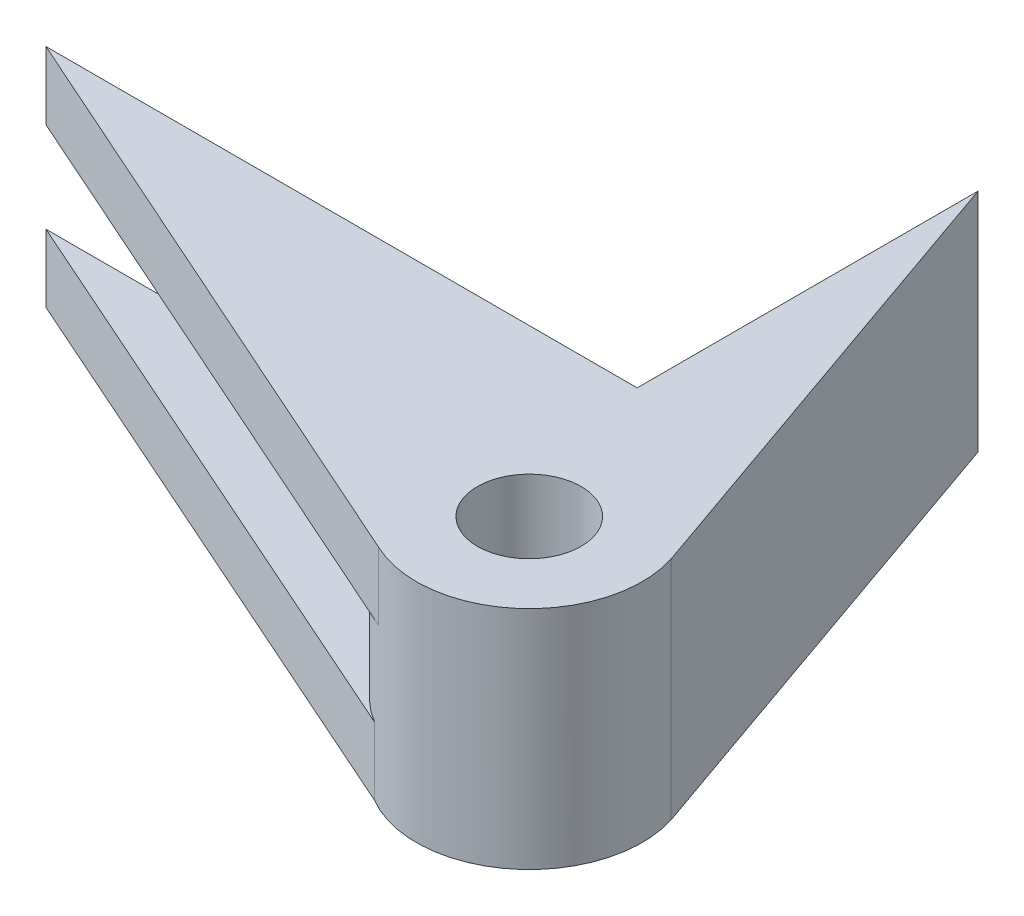
ISO-10303-21;
HEADER;
FILE_DESCRIPTION(('STEP AP214'),'2;1');
FILE_NAME('part.step','',(''),(''),'','','');
FILE_SCHEMA(('AUTOMOTIVE_DESIGN { 1 0 10303 214 1 1 1 1 }'));
ENDSEC;
DATA;
#1=APPLICATION_CONTEXT('core data for automotive mechanical design processes');
#2=APPLICATION_PROTOCOL_DEFINITION('international standard','automotive_design',2000,#1);
#3=PRODUCT_CONTEXT('',#1,'mechanical');
#4=PRODUCT('Part','Part','',(#3));
#5=PRODUCT_RELATED_PRODUCT_CATEGORY('part','',(#4));
#6=PRODUCT_DEFINITION_FORMATION('','',#4);
#7=PRODUCT_DEFINITION_CONTEXT('part definition',#1,'design');
#8=PRODUCT_DEFINITION('design','',#6,#7);
#9=PRODUCT_DEFINITION_SHAPE('','',#8);
#10=(LENGTH_UNIT() NAMED_UNIT(*) SI_UNIT(.MILLI.,.METRE.));
#11=(NAMED_UNIT(*) PLANE_ANGLE_UNIT() SI_UNIT($,.RADIAN.));
#12=(NAMED_UNIT(*) SI_UNIT($,.STERADIAN.) SOLID_ANGLE_UNIT());
#13=UNCERTAINTY_MEASURE_WITH_UNIT(LENGTH_MEASURE(1.E-05),#10,'distance_accuracy_value','');
#14=(GEOMETRIC_REPRESENTATION_CONTEXT(3) GLOBAL_UNCERTAINTY_ASSIGNED_CONTEXT((#13)) GLOBAL_UNIT_ASSIGNED_CONTEXT((#10,
#11,#12)) REPRESENTATION_CONTEXT('',''));
#15=CARTESIAN_POINT('',(0.,0.,0.));
#16=DIRECTION('',(0.,0.,1.));
#17=DIRECTION('',(1.,0.,0.));
#18=AXIS2_PLACEMENT_3D('',#15,#16,#17);
#19=CARTESIAN_POINT('',(25.6796594150439,20.,0.));
#20=DIRECTION('',(-1.,0.,0.));
#21=DIRECTION('',(0.,0.,1.));
#22=AXIS2_PLACEMENT_3D('',#19,#20,#21);
#23=PLANE('',#22);
#24=DIRECTION('',(0.,-1.,0.));
#25=VECTOR('',#24,1.);
#26=CARTESIAN_POINT('',(25.6796594150439,20.,14.6302513629494));
#27=LINE('',#26,#25);
#28=CARTESIAN_POINT('',(25.6796594150439,14.,14.6302513629494));
#29=VERTEX_POINT('',#28);
#30=CARTESIAN_POINT('',(25.6796594150439,6.,14.6302513629494));
#31=VERTEX_POINT('',#30);
#32=EDGE_CURVE('E69',#29,#31,#27,.T.);
#33=ORIENTED_EDGE('',*,*,#32,.F.);
#34=DIRECTION('',(0.,0.,1.));
#35=VECTOR('',#34,1.);
#36=CARTESIAN_POINT('',(25.6796594150439,14.,0.));
#37=LINE('',#36,#35);
#38=CARTESIAN_POINT('',(25.6796594150439,14.,0.));
#39=VERTEX_POINT('',#38);
#40=EDGE_CURVE('E129',#39,#29,#37,.T.);
#41=ORIENTED_EDGE('',*,*,#40,.F.);
#42=DIRECTION('',(0.,-1.,0.));
#43=VECTOR('',#42,1.);
#44=CARTESIAN_POINT('',(25.6796594150439,20.,0.));
#45=LINE('',#44,#43);
#46=CARTESIAN_POINT('',(25.6796594150439,6.,0.));
#47=VERTEX_POINT('',#46);
#48=EDGE_CURVE('E135',#39,#47,#45,.T.);
#49=ORIENTED_EDGE('',*,*,#48,.T.);
#50=DIRECTION('',(0.,0.,1.));
#51=VECTOR('',#50,1.);
#52=CARTESIAN_POINT('',(25.6796594150439,6.,0.));
#53=LINE('',#52,#51);
#54=EDGE_CURVE('E178',#47,#31,#53,.T.);
#55=ORIENTED_EDGE('',*,*,#54,.T.);
#56=EDGE_LOOP('',(#33,#41,#49,#55));
#57=FACE_BOUND('',#56,.T.);
#58=ADVANCED_FACE('F45',(#57),#23,.T.);
#59=CARTESIAN_POINT('',(-3.58051159800601,6.,8.06026924460464));
#60=DIRECTION('',(0.405965167546715,0.,-0.913888550502067));
#61=DIRECTION('',(-0.913888550502067,0.,-0.405965167546715));
#62=AXIS2_PLACEMENT_3D('',#59,#60,#61);
#63=PLANE('',#62);
#64=DIRECTION('',(0.913888550502066,0.,0.405965167546715));
#65=VECTOR('',#64,1.);
#66=CARTESIAN_POINT('',(-3.58051159800601,0.,8.06026924460464));
#67=LINE('',#66,#65);
#68=CARTESIAN_POINT('',(-21.7253879703379,0.,0.));
#69=VERTEX_POINT('',#68);
#70=CARTESIAN_POINT('',(30.59878614381,0.,23.2433069648633));
#71=VERTEX_POINT('',#70);
#72=EDGE_CURVE('E182',#69,#71,#67,.T.);
#73=ORIENTED_EDGE('',*,*,#72,.T.);
#74=DIRECTION('',(0.,-1.,0.));
#75=VECTOR('',#74,1.);
#76=CARTESIAN_POINT('',(30.59878614381,6.,23.2433069648633));
#77=LINE('',#76,#75);
#78=CARTESIAN_POINT('',(30.59878614381,6.,23.2433069648633));
#79=VERTEX_POINT('',#78);
#80=EDGE_CURVE('E11',#79,#71,#77,.T.);
#81=ORIENTED_EDGE('',*,*,#80,.F.);
#82=DIRECTION('',(0.913888550502066,0.,0.405965167546715));
#83=VECTOR('',#82,1.);
#84=CARTESIAN_POINT('',(-3.58051159800601,6.,8.06026924460464));
#85=LINE('',#84,#83);
#86=CARTESIAN_POINT('',(-21.7253879703379,6.,0.));
#87=VERTEX_POINT('',#86);
#88=EDGE_CURVE('E183',#87,#79,#85,.T.);
#89=ORIENTED_EDGE('',*,*,#88,.F.);
#90=DIRECTION('',(0.,-1.,0.));
#91=VECTOR('',#90,1.);
#92=CARTESIAN_POINT('',(-21.7253879703379,6.,0.));
#93=LINE('',#92,#91);
#94=EDGE_CURVE('E190',#87,#69,#93,.T.);
#95=ORIENTED_EDGE('',*,*,#94,.T.);
#96=EDGE_LOOP('',(#73,#81,#89,#95));
#97=FACE_BOUND('',#96,.T.);
#98=ADVANCED_FACE('F47',(#97),#63,.F.);
#99=CARTESIAN_POINT('',(35.6796594150439,6.,14.6302513629494));
#100=DIRECTION('',(0.,-1.,0.));
#101=DIRECTION('',(0.,0.,-1.));
#102=AXIS2_PLACEMENT_3D('',#99,#100,#101);
#103=CYLINDRICAL_SURFACE('',#102,10.);
#104=CARTESIAN_POINT('',(35.6796594150439,20.,14.6302513629494));
#105=DIRECTION('',(0.,1.,0.));
#106=DIRECTION('',(0.,0.,1.));
#107=AXIS2_PLACEMENT_3D('',#104,#105,#106);
#108=CIRCLE('',#107,10.);
#109=CARTESIAN_POINT('',(31.3661425426604,20.,23.6520899888428));
#110=VERTEX_POINT('',#109);
#111=CARTESIAN_POINT('',(45.2163432618192,20.,11.6216534824316));
#112=VERTEX_POINT('',#111);
#113=EDGE_CURVE('E168',#110,#112,#108,.T.);
#114=ORIENTED_EDGE('',*,*,#113,.F.);
#115=DIRECTION('',(0.,1.,0.));
#116=VECTOR('',#115,1.);
#117=CARTESIAN_POINT('',(31.3661425426604,14.,23.6520899888428));
#118=LINE('',#117,#116);
#119=CARTESIAN_POINT('',(31.3661425426604,14.,23.6520899888428));
#120=VERTEX_POINT('',#119);
#121=EDGE_CURVE('E128',#120,#110,#118,.T.);
#122=ORIENTED_EDGE('',*,*,#121,.F.);
#123=CARTESIAN_POINT('',(35.6796594150439,14.,14.6302513629494));
#124=DIRECTION('',(0.,1.,0.));
#125=DIRECTION('',(0.,0.,1.));
#126=AXIS2_PLACEMENT_3D('',#123,#124,#125);
#127=CIRCLE('',#126,10.);
#128=EDGE_CURVE('E141',#29,#120,#127,.T.);
#129=ORIENTED_EDGE('',*,*,#128,.F.);
#130=ORIENTED_EDGE('',*,*,#32,.T.);
#131=CARTESIAN_POINT('',(35.6796594150439,6.,14.6302513629494));
#132=DIRECTION('',(0.,1.,0.));
#133=DIRECTION('',(0.,0.,1.));
#134=AXIS2_PLACEMENT_3D('',#131,#132,#133);
#135=CIRCLE('',#134,10.);
#136=EDGE_CURVE('E175',#79,#31,#135,.F.);
#137=ORIENTED_EDGE('',*,*,#136,.F.);
#138=ORIENTED_EDGE('',*,*,#80,.T.);
#139=CARTESIAN_POINT('',(35.6796594150439,0.,14.6302513629494));
#140=DIRECTION('',(0.,1.,0.));
#141=DIRECTION('',(0.,0.,1.));
#142=AXIS2_PLACEMENT_3D('',#139,#140,#141);
#143=CIRCLE('',#142,10.);
#144=CARTESIAN_POINT('',(45.2163432618192,0.,11.6216534824316));
#145=VERTEX_POINT('',#144);
#146=EDGE_CURVE('E194',#71,#145,#143,.T.);
#147=ORIENTED_EDGE('',*,*,#146,.T.);
#148=DIRECTION('',(0.,-1.,0.));
#149=VECTOR('',#148,1.);
#150=CARTESIAN_POINT('',(45.2163432618192,6.,11.6216534824316));
#151=LINE('',#150,#149);
#152=EDGE_CURVE('E54',#112,#145,#151,.T.);
#153=ORIENTED_EDGE('',*,*,#152,.F.);
#154=EDGE_LOOP('',(#114,#122,#129,#130,#137,#138,#147,#153));
#155=FACE_BOUND('',#154,.T.);
#156=ADVANCED_FACE('F227',(#155),#103,.T.);
#157=CARTESIAN_POINT('',(36.6649466931179,6.,-12.8252191580508));
#158=DIRECTION('',(0.943918642603834,0.,-0.3301781279021));
#159=DIRECTION('',(-0.3301781279021,0.,-0.943918642603834));
#160=AXIS2_PLACEMENT_3D('',#157,#158,#159);
#161=PLANE('',#160);
#162=DIRECTION('',(0.3301781279021,0.,0.943918642603834));
#163=VECTOR('',#162,1.);
#164=CARTESIAN_POINT('',(36.6649466931179,0.,-12.8252191580508));
#165=LINE('',#164,#163);
#166=CARTESIAN_POINT('',(30.59878614381,0.,-30.1672583412685));
#167=VERTEX_POINT('',#166);
#168=EDGE_CURVE('E198',#167,#145,#165,.T.);
#169=ORIENTED_EDGE('',*,*,#168,.F.);
#170=DIRECTION('',(0.,-1.,0.));
#171=VECTOR('',#170,1.);
#172=CARTESIAN_POINT('',(30.59878614381,6.,-30.1672583412685));
#173=LINE('',#172,#171);
#174=CARTESIAN_POINT('',(30.59878614381,20.,-30.1672583412685));
#175=VERTEX_POINT('',#174);
#176=EDGE_CURVE('E218',#175,#167,#173,.T.);
#177=ORIENTED_EDGE('',*,*,#176,.F.);
#178=DIRECTION('',(0.3301781279021,0.,0.943918642603834));
#179=VECTOR('',#178,1.);
#180=CARTESIAN_POINT('',(36.6649466931179,20.,-12.8252191580508));
#181=LINE('',#180,#179);
#182=EDGE_CURVE('E157',#175,#112,#181,.T.);
#183=ORIENTED_EDGE('',*,*,#182,.T.);
#184=ORIENTED_EDGE('',*,*,#152,.T.);
#185=EDGE_LOOP('',(#169,#177,#183,#184));
#186=FACE_BOUND('',#185,.T.);
#187=ADVANCED_FACE('F224',(#186),#161,.T.);
#188=CARTESIAN_POINT('',(30.59878614381,6.,0.));
#189=DIRECTION('',(1.,0.,0.));
#190=DIRECTION('',(0.,0.,-1.));
#191=AXIS2_PLACEMENT_3D('',#188,#189,#190);
#192=PLANE('',#191);
#193=DIRECTION('',(0.,0.,1.));
#194=VECTOR('',#193,1.);
#195=CARTESIAN_POINT('',(30.59878614381,0.,0.));
#196=LINE('',#195,#194);
#197=CARTESIAN_POINT('',(30.59878614381,0.,0.));
#198=VERTEX_POINT('',#197);
#199=EDGE_CURVE('E202',#167,#198,#196,.T.);
#200=ORIENTED_EDGE('',*,*,#199,.T.);
#201=DIRECTION('',(0.,-1.,0.));
#202=VECTOR('',#201,1.);
#203=CARTESIAN_POINT('',(30.59878614381,6.,0.));
#204=LINE('',#203,#202);
#205=CARTESIAN_POINT('',(30.59878614381,20.,0.));
#206=VERTEX_POINT('',#205);
#207=EDGE_CURVE('E214',#206,#198,#204,.T.);
#208=ORIENTED_EDGE('',*,*,#207,.F.);
#209=DIRECTION('',(0.,0.,1.));
#210=VECTOR('',#209,1.);
#211=CARTESIAN_POINT('',(30.59878614381,20.,0.));
#212=LINE('',#211,#210);
#213=EDGE_CURVE('E161',#175,#206,#212,.T.);
#214=ORIENTED_EDGE('',*,*,#213,.F.);
#215=ORIENTED_EDGE('',*,*,#176,.T.);
#216=EDGE_LOOP('',(#200,#208,#214,#215));
#217=FACE_BOUND('',#216,.T.);
#218=ADVANCED_FACE('F236',(#217),#192,.F.);
#219=CARTESIAN_POINT('',(0.,6.,0.));
#220=DIRECTION('',(0.,0.,1.));
#221=DIRECTION('',(1.,0.,0.));
#222=AXIS2_PLACEMENT_3D('',#219,#220,#221);
#223=PLANE('',#222);
#224=DIRECTION('',(-1.,0.,0.));
#225=VECTOR('',#224,1.);
#226=CARTESIAN_POINT('',(0.,6.,0.));
#227=LINE('',#226,#225);
#228=EDGE_CURVE('E186',#47,#87,#227,.T.);
#229=ORIENTED_EDGE('',*,*,#228,.F.);
#230=ORIENTED_EDGE('',*,*,#48,.F.);
#231=DIRECTION('',(1.,0.,0.));
#232=VECTOR('',#231,1.);
#233=CARTESIAN_POINT('',(0.,14.,0.));
#234=LINE('',#233,#232);
#235=CARTESIAN_POINT('',(-21.7253879703379,14.,0.));
#236=VERTEX_POINT('',#235);
#237=EDGE_CURVE('E132',#236,#39,#234,.T.);
#238=ORIENTED_EDGE('',*,*,#237,.F.);
#239=DIRECTION('',(0.,1.,0.));
#240=VECTOR('',#239,1.);
#241=CARTESIAN_POINT('',(-21.7253879703379,14.,0.));
#242=LINE('',#241,#240);
#243=CARTESIAN_POINT('',(-21.7253879703379,20.,0.));
#244=VERTEX_POINT('',#243);
#245=EDGE_CURVE('E119',#236,#244,#242,.T.);
#246=ORIENTED_EDGE('',*,*,#245,.T.);
#247=DIRECTION('',(-1.,0.,0.));
#248=VECTOR('',#247,1.);
#249=CARTESIAN_POINT('',(0.,20.,0.));
#250=LINE('',#249,#248);
#251=EDGE_CURVE('E165',#206,#244,#250,.T.);
#252=ORIENTED_EDGE('',*,*,#251,.F.);
#253=ORIENTED_EDGE('',*,*,#207,.T.);
#254=DIRECTION('',(-1.,0.,0.));
#255=VECTOR('',#254,1.);
#256=CARTESIAN_POINT('',(0.,0.,0.));
#257=LINE('',#256,#255);
#258=EDGE_CURVE('E205',#198,#69,#257,.T.);
#259=ORIENTED_EDGE('',*,*,#258,.T.);
#260=ORIENTED_EDGE('',*,*,#94,.F.);
#261=EDGE_LOOP('',(#229,#230,#238,#246,#252,#253,#259,#260));
#262=FACE_BOUND('',#261,.T.);
#263=ADVANCED_FACE('F134',(#262),#223,.F.);
#264=CARTESIAN_POINT('',(35.6796594150439,6.,14.6302513629494));
#265=DIRECTION('',(0.,-1.,0.));
#266=DIRECTION('',(0.,0.,-1.));
#267=AXIS2_PLACEMENT_3D('',#264,#265,#266);
#268=CYLINDRICAL_SURFACE('',#267,4.59007839635621);
#269=CARTESIAN_POINT('',(35.6796594150439,0.,14.6302513629494));
#270=DIRECTION('',(0.,1.,0.));
#271=DIRECTION('',(0.,0.,1.));
#272=AXIS2_PLACEMENT_3D('',#269,#270,#271);
#273=CIRCLE('',#272,4.59007839635621);
#274=CARTESIAN_POINT('',(35.6796594150439,0.,19.2203297593056));
#275=VERTEX_POINT('',#274);
#276=EDGE_CURVE('E187',#275,#275,#273,.T.);
#277=ORIENTED_EDGE('',*,*,#276,.F.);
#278=EDGE_LOOP('',(#277));
#279=FACE_BOUND('',#278,.T.);
#280=CARTESIAN_POINT('',(35.6796594150439,20.,14.6302513629494));
#281=DIRECTION('',(0.,1.,0.));
#282=DIRECTION('',(0.,0.,1.));
#283=AXIS2_PLACEMENT_3D('',#280,#281,#282);
#284=CIRCLE('',#283,4.59007839635621);
#285=CARTESIAN_POINT('',(35.6796594150439,20.,19.2203297593056));
#286=VERTEX_POINT('',#285);
#287=EDGE_CURVE('E152',#286,#286,#284,.T.);
#288=ORIENTED_EDGE('',*,*,#287,.T.);
#289=EDGE_LOOP('',(#288));
#290=FACE_BOUND('',#289,.T.);
#291=ADVANCED_FACE('F260',(#279,#290),#268,.F.);
#292=CARTESIAN_POINT('',(0.,6.,0.));
#293=DIRECTION('',(0.,1.,0.));
#294=DIRECTION('',(0.,0.,1.));
#295=AXIS2_PLACEMENT_3D('',#292,#293,#294);
#296=PLANE('',#295);
#297=ORIENTED_EDGE('',*,*,#54,.F.);
#298=ORIENTED_EDGE('',*,*,#228,.T.);
#299=ORIENTED_EDGE('',*,*,#88,.T.);
#300=ORIENTED_EDGE('',*,*,#136,.T.);
#301=EDGE_LOOP('',(#297,#298,#299,#300));
#302=FACE_BOUND('',#301,.T.);
#303=ADVANCED_FACE('F244',(#302),#296,.T.);
#304=CARTESIAN_POINT('',(0.,0.,0.));
#305=DIRECTION('',(0.,1.,0.));
#306=DIRECTION('',(0.,0.,1.));
#307=AXIS2_PLACEMENT_3D('',#304,#305,#306);
#308=PLANE('',#307);
#309=ORIENTED_EDGE('',*,*,#72,.F.);
#310=ORIENTED_EDGE('',*,*,#258,.F.);
#311=ORIENTED_EDGE('',*,*,#199,.F.);
#312=ORIENTED_EDGE('',*,*,#168,.T.);
#313=ORIENTED_EDGE('',*,*,#146,.F.);
#314=EDGE_LOOP('',(#309,#310,#311,#312,#313));
#315=FACE_BOUND('',#314,.T.);
#316=ORIENTED_EDGE('',*,*,#276,.T.);
#317=EDGE_LOOP('',(#316));
#318=FACE_BOUND('',#317,.T.);
#319=ADVANCED_FACE('F232',(#315,#318),#308,.F.);
#320=CARTESIAN_POINT('',(0.,20.,0.));
#321=DIRECTION('',(0.,1.,0.));
#322=DIRECTION('',(0.,0.,1.));
#323=AXIS2_PLACEMENT_3D('',#320,#321,#322);
#324=PLANE('',#323);
#325=ORIENTED_EDGE('',*,*,#251,.T.);
#326=DIRECTION('',(0.913454541252689,0.,0.406940783241052));
#327=VECTOR('',#326,1.);
#328=CARTESIAN_POINT('',(-3.5977416513324,20.,8.07580263518794));
#329=LINE('',#328,#327);
#330=EDGE_CURVE('E61',#244,#110,#329,.T.);
#331=ORIENTED_EDGE('',*,*,#330,.T.);
#332=ORIENTED_EDGE('',*,*,#113,.T.);
#333=ORIENTED_EDGE('',*,*,#182,.F.);
#334=ORIENTED_EDGE('',*,*,#213,.T.);
#335=EDGE_LOOP('',(#325,#331,#332,#333,#334));
#336=FACE_BOUND('',#335,.T.);
#337=ORIENTED_EDGE('',*,*,#287,.F.);
#338=EDGE_LOOP('',(#337));
#339=FACE_BOUND('',#338,.T.);
#340=ADVANCED_FACE('F239',(#336,#339),#324,.T.);
#341=CARTESIAN_POINT('',(-3.5977416513324,14.,8.07580263518794));
#342=DIRECTION('',(-0.406940783241052,0.,0.913454541252688));
#343=DIRECTION('',(0.913454541252688,0.,0.406940783241052));
#344=AXIS2_PLACEMENT_3D('',#341,#342,#343);
#345=PLANE('',#344);
#346=ORIENTED_EDGE('',*,*,#330,.F.);
#347=ORIENTED_EDGE('',*,*,#245,.F.);
#348=DIRECTION('',(0.913454541252689,0.,0.406940783241052));
#349=VECTOR('',#348,1.);
#350=CARTESIAN_POINT('',(-3.5977416513324,14.,8.07580263518794));
#351=LINE('',#350,#349);
#352=EDGE_CURVE('E123',#236,#120,#351,.T.);
#353=ORIENTED_EDGE('',*,*,#352,.T.);
#354=ORIENTED_EDGE('',*,*,#121,.T.);
#355=EDGE_LOOP('',(#346,#347,#353,#354));
#356=FACE_BOUND('',#355,.T.);
#357=ADVANCED_FACE('F121',(#356),#345,.T.);
#358=CARTESIAN_POINT('',(0.,14.,0.));
#359=DIRECTION('',(0.,1.,0.));
#360=DIRECTION('',(0.,0.,1.));
#361=AXIS2_PLACEMENT_3D('',#358,#359,#360);
#362=PLANE('',#361);
#363=ORIENTED_EDGE('',*,*,#237,.T.);
#364=ORIENTED_EDGE('',*,*,#40,.T.);
#365=ORIENTED_EDGE('',*,*,#128,.T.);
#366=ORIENTED_EDGE('',*,*,#352,.F.);
#367=EDGE_LOOP('',(#363,#364,#365,#366));
#368=FACE_BOUND('',#367,.T.);
#369=ADVANCED_FACE('F140',(#368),#362,.F.);
#370=CLOSED_SHELL('',(#58,#98,#156,#187,#218,#263,#291,#303,#319,#340,#357,#369));
#371=MANIFOLD_SOLID_BREP('B2',#370);
#372=ADVANCED_BREP_SHAPE_REPRESENTATION('',(#18,#371),#14);
#373=SHAPE_DEFINITION_REPRESENTATION(#9,#372);
ENDSEC;
END-ISO-10303-21;
